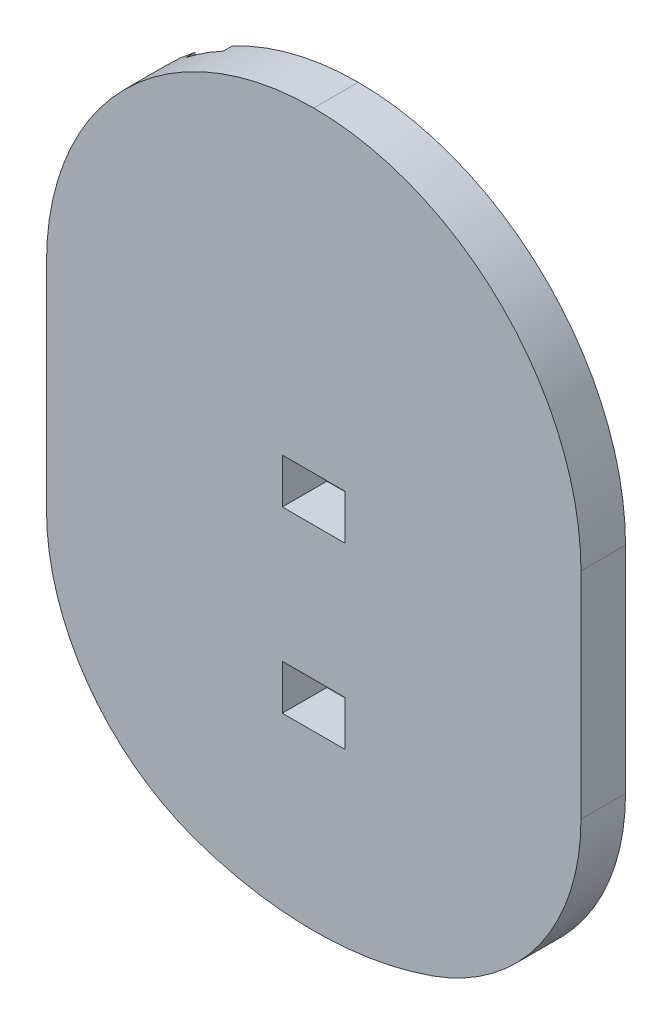
ISO-10303-21;
HEADER;
FILE_DESCRIPTION(('STEP AP214'),'2;1');
FILE_NAME('part.step','',(''),(''),'','','');
FILE_SCHEMA(('AUTOMOTIVE_DESIGN { 1 0 10303 214 1 1 1 1 }'));
ENDSEC;
DATA;
#1=APPLICATION_CONTEXT('core data for automotive mechanical design processes');
#2=APPLICATION_PROTOCOL_DEFINITION('international standard','automotive_design',2000,#1);
#3=PRODUCT_CONTEXT('',#1,'mechanical');
#4=PRODUCT('Part','Part','',(#3));
#5=PRODUCT_RELATED_PRODUCT_CATEGORY('part','',(#4));
#6=PRODUCT_DEFINITION_FORMATION('','',#4);
#7=PRODUCT_DEFINITION_CONTEXT('part definition',#1,'design');
#8=PRODUCT_DEFINITION('design','',#6,#7);
#9=PRODUCT_DEFINITION_SHAPE('','',#8);
#10=(LENGTH_UNIT() NAMED_UNIT(*) SI_UNIT(.MILLI.,.METRE.));
#11=(NAMED_UNIT(*) PLANE_ANGLE_UNIT() SI_UNIT($,.RADIAN.));
#12=(NAMED_UNIT(*) SI_UNIT($,.STERADIAN.) SOLID_ANGLE_UNIT());
#13=UNCERTAINTY_MEASURE_WITH_UNIT(LENGTH_MEASURE(1.E-05),#10,'distance_accuracy_value','');
#14=(GEOMETRIC_REPRESENTATION_CONTEXT(3) GLOBAL_UNCERTAINTY_ASSIGNED_CONTEXT((#13)) GLOBAL_UNIT_ASSIGNED_CONTEXT((#10,
#11,#12)) REPRESENTATION_CONTEXT('',''));
#15=CARTESIAN_POINT('',(0.,0.,0.));
#16=DIRECTION('',(0.,0.,1.));
#17=DIRECTION('',(1.,0.,0.));
#18=AXIS2_PLACEMENT_3D('',#15,#16,#17);
#19=CARTESIAN_POINT('',(0.,0.,5.));
#20=DIRECTION('',(0.,0.,-1.));
#21=DIRECTION('',(-1.,0.,0.));
#22=AXIS2_PLACEMENT_3D('',#19,#20,#21);
#23=CYLINDRICAL_SURFACE('',#22,40.);
#24=CARTESIAN_POINT('',(0.,0.,5.));
#25=DIRECTION('',(0.,0.,1.));
#26=DIRECTION('',(1.,0.,0.));
#27=AXIS2_PLACEMENT_3D('',#24,#25,#26);
#28=CIRCLE('',#27,40.);
#29=CARTESIAN_POINT('',(-13.3333333333333,-37.7123616632825,5.));
#30=VERTEX_POINT('',#29);
#31=CARTESIAN_POINT('',(13.3333333333333,-37.7123616632825,5.));
#32=VERTEX_POINT('',#31);
#33=EDGE_CURVE('E238',#30,#32,#28,.T.);
#34=ORIENTED_EDGE('',*,*,#33,.F.);
#35=DIRECTION('',(0.,0.,-1.));
#36=VECTOR('',#35,1.);
#37=CARTESIAN_POINT('',(-13.3333333333333,-37.7123616632825,5.));
#38=LINE('',#37,#36);
#39=CARTESIAN_POINT('',(-13.3333333333333,-37.7123616632825,0.));
#40=VERTEX_POINT('',#39);
#41=EDGE_CURVE('E276',#30,#40,#38,.T.);
#42=ORIENTED_EDGE('',*,*,#41,.T.);
#43=CARTESIAN_POINT('',(0.,0.,0.));
#44=DIRECTION('',(0.,0.,1.));
#45=DIRECTION('',(1.,0.,0.));
#46=AXIS2_PLACEMENT_3D('',#43,#44,#45);
#47=CIRCLE('',#46,40.);
#48=CARTESIAN_POINT('',(13.3333333333333,-37.7123616632825,0.));
#49=VERTEX_POINT('',#48);
#50=EDGE_CURVE('E234',#40,#49,#47,.T.);
#51=ORIENTED_EDGE('',*,*,#50,.T.);
#52=DIRECTION('',(0.,0.,-1.));
#53=VECTOR('',#52,1.);
#54=CARTESIAN_POINT('',(13.3333333333333,-37.7123616632825,5.));
#55=LINE('',#54,#53);
#56=EDGE_CURVE('E273',#49,#32,#55,.F.);
#57=ORIENTED_EDGE('',*,*,#56,.T.);
#58=EDGE_LOOP('',(#34,#42,#51,#57));
#59=FACE_BOUND('',#58,.T.);
#60=ADVANCED_FACE('F33',(#59),#23,.T.);
#61=CARTESIAN_POINT('',(0.,0.,5.));
#62=DIRECTION('',(0.,0.,1.));
#63=DIRECTION('',(1.,0.,0.));
#64=AXIS2_PLACEMENT_3D('',#61,#62,#63);
#65=PLANE('',#64);
#66=DIRECTION('',(0.,1.,0.));
#67=VECTOR('',#66,1.);
#68=CARTESIAN_POINT('',(3.525,4.5,5.));
#69=LINE('',#68,#67);
#70=CARTESIAN_POINT('',(3.525,-0.549999999999995,5.));
#71=VERTEX_POINT('',#70);
#72=CARTESIAN_POINT('',(3.525,4.5,5.));
#73=VERTEX_POINT('',#72);
#74=EDGE_CURVE('E56',#71,#73,#69,.T.);
#75=ORIENTED_EDGE('',*,*,#74,.F.);
#76=DIRECTION('',(1.,0.,0.));
#77=VECTOR('',#76,1.);
#78=CARTESIAN_POINT('',(-3.525,-0.549999999999995,5.));
#79=LINE('',#78,#77);
#80=CARTESIAN_POINT('',(-3.525,-0.549999999999995,5.));
#81=VERTEX_POINT('',#80);
#82=EDGE_CURVE('E202',#81,#71,#79,.T.);
#83=ORIENTED_EDGE('',*,*,#82,.F.);
#84=DIRECTION('',(0.,-1.,0.));
#85=VECTOR('',#84,1.);
#86=CARTESIAN_POINT('',(-3.525,4.5,5.));
#87=LINE('',#86,#85);
#88=CARTESIAN_POINT('',(-3.525,4.5,5.));
#89=VERTEX_POINT('',#88);
#90=EDGE_CURVE('E199',#89,#81,#87,.T.);
#91=ORIENTED_EDGE('',*,*,#90,.F.);
#92=DIRECTION('',(-1.,0.,0.));
#93=VECTOR('',#92,1.);
#94=CARTESIAN_POINT('',(-3.525,4.5,5.));
#95=LINE('',#94,#93);
#96=EDGE_CURVE('E195',#73,#89,#95,.T.);
#97=ORIENTED_EDGE('',*,*,#96,.F.);
#98=EDGE_LOOP('',(#75,#83,#91,#97));
#99=FACE_BOUND('',#98,.T.);
#100=DIRECTION('',(0.,1.,0.));
#101=VECTOR('',#100,1.);
#102=CARTESIAN_POINT('',(3.525,-15.55,5.));
#103=LINE('',#102,#101);
#104=CARTESIAN_POINT('',(3.525,-20.6,5.));
#105=VERTEX_POINT('',#104);
#106=CARTESIAN_POINT('',(3.525,-15.55,5.));
#107=VERTEX_POINT('',#106);
#108=EDGE_CURVE('E192',#105,#107,#103,.T.);
#109=ORIENTED_EDGE('',*,*,#108,.F.);
#110=DIRECTION('',(1.,0.,0.));
#111=VECTOR('',#110,1.);
#112=CARTESIAN_POINT('',(-3.525,-20.6,5.));
#113=LINE('',#112,#111);
#114=CARTESIAN_POINT('',(-3.525,-20.6,5.));
#115=VERTEX_POINT('',#114);
#116=EDGE_CURVE('E221',#115,#105,#113,.T.);
#117=ORIENTED_EDGE('',*,*,#116,.F.);
#118=DIRECTION('',(0.,-1.,0.));
#119=VECTOR('',#118,1.);
#120=CARTESIAN_POINT('',(-3.525,-15.55,5.));
#121=LINE('',#120,#119);
#122=CARTESIAN_POINT('',(-3.525,-15.55,5.));
#123=VERTEX_POINT('',#122);
#124=EDGE_CURVE('E218',#123,#115,#121,.T.);
#125=ORIENTED_EDGE('',*,*,#124,.F.);
#126=DIRECTION('',(-1.,0.,0.));
#127=VECTOR('',#126,1.);
#128=CARTESIAN_POINT('',(-3.525,-15.55,5.));
#129=LINE('',#128,#127);
#130=EDGE_CURVE('E215',#107,#123,#129,.T.);
#131=ORIENTED_EDGE('',*,*,#130,.F.);
#132=EDGE_LOOP('',(#109,#117,#125,#131));
#133=FACE_BOUND('',#132,.T.);
#134=DIRECTION('',(0.,1.,0.));
#135=VECTOR('',#134,1.);
#136=CARTESIAN_POINT('',(-30.,26.4575131106459,5.));
#137=LINE('',#136,#135);
#138=CARTESIAN_POINT('',(-30.,-14.1421356237309,5.));
#139=VERTEX_POINT('',#138);
#140=CARTESIAN_POINT('',(-30.,10.,5.));
#141=VERTEX_POINT('',#140);
#142=EDGE_CURVE('E232',#139,#141,#137,.T.);
#143=ORIENTED_EDGE('',*,*,#142,.F.);
#144=CARTESIAN_POINT('',(-5.,-14.142135623731,5.));
#145=DIRECTION('',(0.,0.,1.));
#146=DIRECTION('',(1.,0.,0.));
#147=AXIS2_PLACEMENT_3D('',#144,#145,#146);
#148=CIRCLE('',#147,25.);
#149=EDGE_CURVE('E271',#139,#30,#148,.T.);
#150=ORIENTED_EDGE('',*,*,#149,.T.);
#151=ORIENTED_EDGE('',*,*,#33,.T.);
#152=CARTESIAN_POINT('',(5.,-14.142135623731,5.));
#153=DIRECTION('',(0.,0.,1.));
#154=DIRECTION('',(1.,0.,0.));
#155=AXIS2_PLACEMENT_3D('',#152,#153,#154);
#156=CIRCLE('',#155,25.);
#157=CARTESIAN_POINT('',(30.,-14.1421356237309,5.));
#158=VERTEX_POINT('',#157);
#159=EDGE_CURVE('E269',#32,#158,#156,.T.);
#160=ORIENTED_EDGE('',*,*,#159,.T.);
#161=DIRECTION('',(0.,-1.,0.));
#162=VECTOR('',#161,1.);
#163=CARTESIAN_POINT('',(30.,26.4575131106459,5.));
#164=LINE('',#163,#162);
#165=CARTESIAN_POINT('',(30.,10.,5.));
#166=VERTEX_POINT('',#165);
#167=EDGE_CURVE('E235',#166,#158,#164,.T.);
#168=ORIENTED_EDGE('',*,*,#167,.F.);
#169=CARTESIAN_POINT('',(0.,10.,5.));
#170=DIRECTION('',(0.,0.,1.));
#171=DIRECTION('',(1.,0.,0.));
#172=AXIS2_PLACEMENT_3D('',#169,#170,#171);
#173=CIRCLE('',#172,30.);
#174=CARTESIAN_POINT('',(0.,40.,5.));
#175=VERTEX_POINT('',#174);
#176=EDGE_CURVE('E248',#166,#175,#173,.T.);
#177=ORIENTED_EDGE('',*,*,#176,.T.);
#178=CARTESIAN_POINT('',(0.,10.,5.));
#179=DIRECTION('',(0.,0.,1.));
#180=DIRECTION('',(1.,0.,0.));
#181=AXIS2_PLACEMENT_3D('',#178,#179,#180);
#182=CIRCLE('',#181,30.);
#183=EDGE_CURVE('E250',#175,#141,#182,.T.);
#184=ORIENTED_EDGE('',*,*,#183,.T.);
#185=EDGE_LOOP('',(#143,#150,#151,#160,#168,#177,#184));
#186=FACE_BOUND('',#185,.T.);
#187=ADVANCED_FACE('F327',(#99,#133,#186),#65,.T.);
#188=CARTESIAN_POINT('',(0.,0.,0.));
#189=DIRECTION('',(0.,0.,1.));
#190=DIRECTION('',(1.,0.,0.));
#191=AXIS2_PLACEMENT_3D('',#188,#189,#190);
#192=PLANE('',#191);
#193=DIRECTION('',(1.,0.,0.));
#194=VECTOR('',#193,1.);
#195=CARTESIAN_POINT('',(0.,-0.549999999999995,0.));
#196=LINE('',#195,#194);
#197=CARTESIAN_POINT('',(-3.525,-0.549999999999995,0.));
#198=VERTEX_POINT('',#197);
#199=CARTESIAN_POINT('',(3.525,-0.549999999999995,0.));
#200=VERTEX_POINT('',#199);
#201=EDGE_CURVE('E302',#198,#200,#196,.T.);
#202=ORIENTED_EDGE('',*,*,#201,.T.);
#203=DIRECTION('',(0.,1.,0.));
#204=VECTOR('',#203,1.);
#205=CARTESIAN_POINT('',(3.525,0.,0.));
#206=LINE('',#205,#204);
#207=CARTESIAN_POINT('',(3.525,4.5,0.));
#208=VERTEX_POINT('',#207);
#209=EDGE_CURVE('E305',#200,#208,#206,.T.);
#210=ORIENTED_EDGE('',*,*,#209,.T.);
#211=DIRECTION('',(-1.,0.,0.));
#212=VECTOR('',#211,1.);
#213=CARTESIAN_POINT('',(0.,4.5,0.));
#214=LINE('',#213,#212);
#215=CARTESIAN_POINT('',(-3.525,4.5,0.));
#216=VERTEX_POINT('',#215);
#217=EDGE_CURVE('E296',#208,#216,#214,.T.);
#218=ORIENTED_EDGE('',*,*,#217,.T.);
#219=DIRECTION('',(0.,-1.,0.));
#220=VECTOR('',#219,1.);
#221=CARTESIAN_POINT('',(-3.525,0.,0.));
#222=LINE('',#221,#220);
#223=EDGE_CURVE('E299',#216,#198,#222,.T.);
#224=ORIENTED_EDGE('',*,*,#223,.T.);
#225=EDGE_LOOP('',(#202,#210,#218,#224));
#226=FACE_BOUND('',#225,.T.);
#227=DIRECTION('',(1.,0.,0.));
#228=VECTOR('',#227,1.);
#229=CARTESIAN_POINT('',(0.,-20.6,0.));
#230=LINE('',#229,#228);
#231=CARTESIAN_POINT('',(-3.525,-20.6,0.));
#232=VERTEX_POINT('',#231);
#233=CARTESIAN_POINT('',(3.525,-20.6,0.));
#234=VERTEX_POINT('',#233);
#235=EDGE_CURVE('E290',#232,#234,#230,.T.);
#236=ORIENTED_EDGE('',*,*,#235,.T.);
#237=DIRECTION('',(0.,1.,0.));
#238=VECTOR('',#237,1.);
#239=CARTESIAN_POINT('',(3.525,0.,0.));
#240=LINE('',#239,#238);
#241=CARTESIAN_POINT('',(3.525,-15.55,0.));
#242=VERTEX_POINT('',#241);
#243=EDGE_CURVE('E293',#234,#242,#240,.T.);
#244=ORIENTED_EDGE('',*,*,#243,.T.);
#245=DIRECTION('',(-1.,0.,0.));
#246=VECTOR('',#245,1.);
#247=CARTESIAN_POINT('',(0.,-15.55,0.));
#248=LINE('',#247,#246);
#249=CARTESIAN_POINT('',(-3.525,-15.55,0.));
#250=VERTEX_POINT('',#249);
#251=EDGE_CURVE('E284',#242,#250,#248,.T.);
#252=ORIENTED_EDGE('',*,*,#251,.T.);
#253=DIRECTION('',(0.,-1.,0.));
#254=VECTOR('',#253,1.);
#255=CARTESIAN_POINT('',(-3.525,0.,0.));
#256=LINE('',#255,#254);
#257=EDGE_CURVE('E287',#250,#232,#256,.T.);
#258=ORIENTED_EDGE('',*,*,#257,.T.);
#259=EDGE_LOOP('',(#236,#244,#252,#258));
#260=FACE_BOUND('',#259,.T.);
#261=DIRECTION('',(-0.866025403784438,-0.500000000000001,0.));
#262=VECTOR('',#261,1.);
#263=CARTESIAN_POINT('',(-9.91829537858543,29.0997310684254,0.));
#264=LINE('',#263,#262);
#265=CARTESIAN_POINT('',(-9.91829537858543,29.0997310684254,0.));
#266=VERTEX_POINT('',#265);
#267=CARTESIAN_POINT('',(-14.2484223975076,26.5997310684254,0.));
#268=VERTEX_POINT('',#267);
#269=EDGE_CURVE('E189',#266,#268,#264,.T.);
#270=ORIENTED_EDGE('',*,*,#269,.F.);
#271=DIRECTION('',(0.500000000000001,-0.866025403784438,0.));
#272=VECTOR('',#271,1.);
#273=CARTESIAN_POINT('',(-14.1682953785854,36.4609470005931,0.));
#274=LINE('',#273,#272);
#275=CARTESIAN_POINT('',(-14.1606074909395,36.4476311885875,0.));
#276=VERTEX_POINT('',#275);
#277=EDGE_CURVE('E178',#276,#266,#274,.T.);
#278=ORIENTED_EDGE('',*,*,#277,.F.);
#279=CARTESIAN_POINT('',(0.,10.,0.));
#280=DIRECTION('',(0.,0.,1.));
#281=DIRECTION('',(1.,0.,0.));
#282=AXIS2_PLACEMENT_3D('',#279,#280,#281);
#283=CIRCLE('',#282,30.);
#284=CARTESIAN_POINT('',(0.,40.,0.));
#285=VERTEX_POINT('',#284);
#286=EDGE_CURVE('E258',#276,#285,#283,.F.);
#287=ORIENTED_EDGE('',*,*,#286,.T.);
#288=CARTESIAN_POINT('',(0.,10.,0.));
#289=DIRECTION('',(0.,0.,1.));
#290=DIRECTION('',(1.,0.,0.));
#291=AXIS2_PLACEMENT_3D('',#288,#289,#290);
#292=CIRCLE('',#291,30.);
#293=CARTESIAN_POINT('',(30.,10.,0.));
#294=VERTEX_POINT('',#293);
#295=EDGE_CURVE('E256',#285,#294,#292,.F.);
#296=ORIENTED_EDGE('',*,*,#295,.T.);
#297=DIRECTION('',(0.,-1.,0.));
#298=VECTOR('',#297,1.);
#299=CARTESIAN_POINT('',(30.,0.,0.));
#300=LINE('',#299,#298);
#301=CARTESIAN_POINT('',(30.,-14.142135623731,0.));
#302=VERTEX_POINT('',#301);
#303=EDGE_CURVE('E241',#294,#302,#300,.T.);
#304=ORIENTED_EDGE('',*,*,#303,.T.);
#305=CARTESIAN_POINT('',(5.,-14.142135623731,0.));
#306=DIRECTION('',(0.,0.,1.));
#307=DIRECTION('',(1.,0.,0.));
#308=AXIS2_PLACEMENT_3D('',#305,#306,#307);
#309=CIRCLE('',#308,25.);
#310=EDGE_CURVE('E278',#302,#49,#309,.F.);
#311=ORIENTED_EDGE('',*,*,#310,.T.);
#312=ORIENTED_EDGE('',*,*,#50,.F.);
#313=CARTESIAN_POINT('',(-5.,-14.142135623731,0.));
#314=DIRECTION('',(0.,0.,1.));
#315=DIRECTION('',(1.,0.,0.));
#316=AXIS2_PLACEMENT_3D('',#313,#314,#315);
#317=CIRCLE('',#316,25.);
#318=CARTESIAN_POINT('',(-30.,-14.142135623731,0.));
#319=VERTEX_POINT('',#318);
#320=EDGE_CURVE('E280',#40,#319,#317,.F.);
#321=ORIENTED_EDGE('',*,*,#320,.T.);
#322=DIRECTION('',(0.,1.,0.));
#323=VECTOR('',#322,1.);
#324=CARTESIAN_POINT('',(-30.,0.,0.));
#325=LINE('',#324,#323);
#326=CARTESIAN_POINT('',(-30.,10.,0.));
#327=VERTEX_POINT('',#326);
#328=EDGE_CURVE('E246',#319,#327,#325,.T.);
#329=ORIENTED_EDGE('',*,*,#328,.T.);
#330=CARTESIAN_POINT('',(-18.3618118800429,33.7243306434959,0.));
#331=VERTEX_POINT('',#330);
#332=EDGE_CURVE('E259',#327,#331,#283,.F.);
#333=ORIENTED_EDGE('',*,*,#332,.T.);
#334=DIRECTION('',(-0.500000000000001,0.866025403784438,0.));
#335=VECTOR('',#334,1.);
#336=CARTESIAN_POINT('',(-14.2484223975076,26.5997310684254,0.));
#337=LINE('',#336,#335);
#338=EDGE_CURVE('E172',#268,#331,#337,.T.);
#339=ORIENTED_EDGE('',*,*,#338,.F.);
#340=EDGE_LOOP('',(#270,#278,#287,#296,#304,#311,#312,#321,#329,#333,#339));
#341=FACE_BOUND('',#340,.T.);
#342=ADVANCED_FACE('F317',(#226,#260,#341),#192,.F.);
#343=CARTESIAN_POINT('',(30.,26.4575131106459,-5.));
#344=DIRECTION('',(-1.,0.,0.));
#345=DIRECTION('',(0.,0.,1.));
#346=AXIS2_PLACEMENT_3D('',#343,#344,#345);
#347=PLANE('',#346);
#348=ORIENTED_EDGE('',*,*,#167,.T.);
#349=DIRECTION('',(0.,0.,-1.));
#350=VECTOR('',#349,1.);
#351=CARTESIAN_POINT('',(30.,-14.1421356237309,-5.));
#352=LINE('',#351,#350);
#353=EDGE_CURVE('E282',#158,#302,#352,.T.);
#354=ORIENTED_EDGE('',*,*,#353,.T.);
#355=ORIENTED_EDGE('',*,*,#303,.F.);
#356=DIRECTION('',(0.,0.,-1.));
#357=VECTOR('',#356,1.);
#358=CARTESIAN_POINT('',(30.,10.,-5.));
#359=LINE('',#358,#357);
#360=EDGE_CURVE('E262',#294,#166,#359,.F.);
#361=ORIENTED_EDGE('',*,*,#360,.T.);
#362=EDGE_LOOP('',(#348,#354,#355,#361));
#363=FACE_BOUND('',#362,.T.);
#364=ADVANCED_FACE('F337',(#363),#347,.F.);
#365=CARTESIAN_POINT('',(-30.,26.4575131106459,-5.));
#366=DIRECTION('',(1.,0.,0.));
#367=DIRECTION('',(0.,0.,-1.));
#368=AXIS2_PLACEMENT_3D('',#365,#366,#367);
#369=PLANE('',#368);
#370=ORIENTED_EDGE('',*,*,#328,.F.);
#371=DIRECTION('',(0.,0.,-1.));
#372=VECTOR('',#371,1.);
#373=CARTESIAN_POINT('',(-30.,-14.1421356237309,-5.));
#374=LINE('',#373,#372);
#375=EDGE_CURVE('E264',#319,#139,#374,.F.);
#376=ORIENTED_EDGE('',*,*,#375,.T.);
#377=ORIENTED_EDGE('',*,*,#142,.T.);
#378=DIRECTION('',(0.,0.,-1.));
#379=VECTOR('',#378,1.);
#380=CARTESIAN_POINT('',(-30.,10.,-5.));
#381=LINE('',#380,#379);
#382=EDGE_CURVE('E253',#141,#327,#381,.T.);
#383=ORIENTED_EDGE('',*,*,#382,.T.);
#384=EDGE_LOOP('',(#370,#376,#377,#383));
#385=FACE_BOUND('',#384,.T.);
#386=ADVANCED_FACE('F323',(#385),#369,.F.);
#387=CARTESIAN_POINT('',(0.,10.,5.));
#388=DIRECTION('',(0.,0.,-1.));
#389=DIRECTION('',(-1.,0.,0.));
#390=AXIS2_PLACEMENT_3D('',#387,#388,#389);
#391=CYLINDRICAL_SURFACE('',#390,30.);
#392=ORIENTED_EDGE('',*,*,#360,.F.);
#393=ORIENTED_EDGE('',*,*,#295,.F.);
#394=DIRECTION('',(0.,0.,-1.));
#395=VECTOR('',#394,1.);
#396=CARTESIAN_POINT('',(0.,40.,5.));
#397=LINE('',#396,#395);
#398=EDGE_CURVE('E208',#175,#285,#397,.T.);
#399=ORIENTED_EDGE('',*,*,#398,.F.);
#400=ORIENTED_EDGE('',*,*,#176,.F.);
#401=EDGE_LOOP('',(#392,#393,#399,#400));
#402=FACE_BOUND('',#401,.T.);
#403=ADVANCED_FACE('F333',(#402),#391,.T.);
#404=CARTESIAN_POINT('',(0.,10.,5.));
#405=DIRECTION('',(0.,0.,-1.));
#406=DIRECTION('',(-1.,0.,0.));
#407=AXIS2_PLACEMENT_3D('',#404,#405,#406);
#408=CYLINDRICAL_SURFACE('',#407,30.);
#409=DIRECTION('',(0.,0.,-1.));
#410=VECTOR('',#409,1.);
#411=CARTESIAN_POINT('',(-14.1606074909395,36.4476311885875,5.));
#412=LINE('',#411,#410);
#413=CARTESIAN_POINT('',(-14.1606074909395,36.4476311885875,1.));
#414=VERTEX_POINT('',#413);
#415=EDGE_CURVE('E11',#414,#276,#412,.T.);
#416=ORIENTED_EDGE('',*,*,#415,.F.);
#417=CARTESIAN_POINT('',(0.,10.,1.));
#418=DIRECTION('',(0.,0.,-1.));
#419=DIRECTION('',(-1.,0.,0.));
#420=AXIS2_PLACEMENT_3D('',#417,#418,#419);
#421=CIRCLE('',#420,30.);
#422=CARTESIAN_POINT('',(-18.3618118800429,33.7243306434959,1.));
#423=VERTEX_POINT('',#422);
#424=EDGE_CURVE('E169',#414,#423,#421,.F.);
#425=ORIENTED_EDGE('',*,*,#424,.T.);
#426=DIRECTION('',(0.,0.,-1.));
#427=VECTOR('',#426,1.);
#428=CARTESIAN_POINT('',(-18.3618118800429,33.7243306434959,5.));
#429=LINE('',#428,#427);
#430=EDGE_CURVE('E41',#331,#423,#429,.F.);
#431=ORIENTED_EDGE('',*,*,#430,.F.);
#432=ORIENTED_EDGE('',*,*,#332,.F.);
#433=ORIENTED_EDGE('',*,*,#382,.F.);
#434=ORIENTED_EDGE('',*,*,#183,.F.);
#435=ORIENTED_EDGE('',*,*,#398,.T.);
#436=ORIENTED_EDGE('',*,*,#286,.F.);
#437=EDGE_LOOP('',(#416,#425,#431,#432,#433,#434,#435,#436));
#438=FACE_BOUND('',#437,.T.);
#439=ADVANCED_FACE('F314',(#438),#408,.T.);
#440=CARTESIAN_POINT('',(-5.,-14.142135623731,5.));
#441=DIRECTION('',(0.,0.,-1.));
#442=DIRECTION('',(-1.,0.,0.));
#443=AXIS2_PLACEMENT_3D('',#440,#441,#442);
#444=CYLINDRICAL_SURFACE('',#443,25.);
#445=ORIENTED_EDGE('',*,*,#320,.F.);
#446=ORIENTED_EDGE('',*,*,#41,.F.);
#447=ORIENTED_EDGE('',*,*,#149,.F.);
#448=ORIENTED_EDGE('',*,*,#375,.F.);
#449=EDGE_LOOP('',(#445,#446,#447,#448));
#450=FACE_BOUND('',#449,.T.);
#451=ADVANCED_FACE('F347',(#450),#444,.T.);
#452=CARTESIAN_POINT('',(5.,-14.142135623731,5.));
#453=DIRECTION('',(0.,0.,-1.));
#454=DIRECTION('',(-1.,0.,0.));
#455=AXIS2_PLACEMENT_3D('',#452,#453,#454);
#456=CYLINDRICAL_SURFACE('',#455,25.);
#457=ORIENTED_EDGE('',*,*,#310,.F.);
#458=ORIENTED_EDGE('',*,*,#353,.F.);
#459=ORIENTED_EDGE('',*,*,#159,.F.);
#460=ORIENTED_EDGE('',*,*,#56,.F.);
#461=EDGE_LOOP('',(#457,#458,#459,#460));
#462=FACE_BOUND('',#461,.T.);
#463=ADVANCED_FACE('F35',(#462),#456,.T.);
#464=CARTESIAN_POINT('',(3.525,-15.55,-5.));
#465=DIRECTION('',(1.,0.,0.));
#466=DIRECTION('',(0.,1.,0.));
#467=AXIS2_PLACEMENT_3D('',#464,#465,#466);
#468=PLANE('',#467);
#469=DIRECTION('',(0.,0.,1.));
#470=VECTOR('',#469,1.);
#471=CARTESIAN_POINT('',(3.525,-20.6,-5.));
#472=LINE('',#471,#470);
#473=EDGE_CURVE('E196',#234,#105,#472,.T.);
#474=ORIENTED_EDGE('',*,*,#473,.T.);
#475=ORIENTED_EDGE('',*,*,#108,.T.);
#476=DIRECTION('',(0.,0.,1.));
#477=VECTOR('',#476,1.);
#478=CARTESIAN_POINT('',(3.525,-15.55,-5.));
#479=LINE('',#478,#477);
#480=EDGE_CURVE('E224',#242,#107,#479,.T.);
#481=ORIENTED_EDGE('',*,*,#480,.F.);
#482=ORIENTED_EDGE('',*,*,#243,.F.);
#483=EDGE_LOOP('',(#474,#475,#481,#482));
#484=FACE_BOUND('',#483,.T.);
#485=ADVANCED_FACE('F353',(#484),#468,.F.);
#486=CARTESIAN_POINT('',(-3.525,-20.6,-5.));
#487=DIRECTION('',(0.,-1.,0.));
#488=DIRECTION('',(0.,0.,-1.));
#489=AXIS2_PLACEMENT_3D('',#486,#487,#488);
#490=PLANE('',#489);
#491=DIRECTION('',(0.,0.,1.));
#492=VECTOR('',#491,1.);
#493=CARTESIAN_POINT('',(-3.525,-20.6,-5.));
#494=LINE('',#493,#492);
#495=EDGE_CURVE('E226',#232,#115,#494,.T.);
#496=ORIENTED_EDGE('',*,*,#495,.T.);
#497=ORIENTED_EDGE('',*,*,#116,.T.);
#498=ORIENTED_EDGE('',*,*,#473,.F.);
#499=ORIENTED_EDGE('',*,*,#235,.F.);
#500=EDGE_LOOP('',(#496,#497,#498,#499));
#501=FACE_BOUND('',#500,.T.);
#502=ADVANCED_FACE('F377',(#501),#490,.F.);
#503=CARTESIAN_POINT('',(-3.525,-15.55,-5.));
#504=DIRECTION('',(-1.,0.,0.));
#505=DIRECTION('',(0.,-1.,0.));
#506=AXIS2_PLACEMENT_3D('',#503,#504,#505);
#507=PLANE('',#506);
#508=DIRECTION('',(0.,0.,1.));
#509=VECTOR('',#508,1.);
#510=CARTESIAN_POINT('',(-3.525,-15.55,-5.));
#511=LINE('',#510,#509);
#512=EDGE_CURVE('E228',#250,#123,#511,.T.);
#513=ORIENTED_EDGE('',*,*,#512,.T.);
#514=ORIENTED_EDGE('',*,*,#124,.T.);
#515=ORIENTED_EDGE('',*,*,#495,.F.);
#516=ORIENTED_EDGE('',*,*,#257,.F.);
#517=EDGE_LOOP('',(#513,#514,#515,#516));
#518=FACE_BOUND('',#517,.T.);
#519=ADVANCED_FACE('F383',(#518),#507,.F.);
#520=CARTESIAN_POINT('',(-3.525,-15.55,-5.));
#521=DIRECTION('',(0.,1.,0.));
#522=DIRECTION('',(0.,0.,1.));
#523=AXIS2_PLACEMENT_3D('',#520,#521,#522);
#524=PLANE('',#523);
#525=ORIENTED_EDGE('',*,*,#480,.T.);
#526=ORIENTED_EDGE('',*,*,#130,.T.);
#527=ORIENTED_EDGE('',*,*,#512,.F.);
#528=ORIENTED_EDGE('',*,*,#251,.F.);
#529=EDGE_LOOP('',(#525,#526,#527,#528));
#530=FACE_BOUND('',#529,.T.);
#531=ADVANCED_FACE('F379',(#530),#524,.F.);
#532=CARTESIAN_POINT('',(3.525,4.5,-5.));
#533=DIRECTION('',(1.,0.,0.));
#534=DIRECTION('',(0.,1.,0.));
#535=AXIS2_PLACEMENT_3D('',#532,#533,#534);
#536=PLANE('',#535);
#537=DIRECTION('',(0.,0.,1.));
#538=VECTOR('',#537,1.);
#539=CARTESIAN_POINT('',(3.525,-0.549999999999995,-5.));
#540=LINE('',#539,#538);
#541=EDGE_CURVE('E206',#200,#71,#540,.T.);
#542=ORIENTED_EDGE('',*,*,#541,.T.);
#543=ORIENTED_EDGE('',*,*,#74,.T.);
#544=DIRECTION('',(0.,0.,1.));
#545=VECTOR('',#544,1.);
#546=CARTESIAN_POINT('',(3.525,4.5,-5.));
#547=LINE('',#546,#545);
#548=EDGE_CURVE('E205',#208,#73,#547,.T.);
#549=ORIENTED_EDGE('',*,*,#548,.F.);
#550=ORIENTED_EDGE('',*,*,#209,.F.);
#551=EDGE_LOOP('',(#542,#543,#549,#550));
#552=FACE_BOUND('',#551,.T.);
#553=ADVANCED_FACE('F382',(#552),#536,.F.);
#554=CARTESIAN_POINT('',(-3.525,-0.549999999999995,-5.));
#555=DIRECTION('',(0.,-1.,0.));
#556=DIRECTION('',(1.,0.,0.));
#557=AXIS2_PLACEMENT_3D('',#554,#555,#556);
#558=PLANE('',#557);
#559=DIRECTION('',(0.,0.,1.));
#560=VECTOR('',#559,1.);
#561=CARTESIAN_POINT('',(-3.525,-0.549999999999995,-5.));
#562=LINE('',#561,#560);
#563=EDGE_CURVE('E209',#198,#81,#562,.T.);
#564=ORIENTED_EDGE('',*,*,#563,.T.);
#565=ORIENTED_EDGE('',*,*,#82,.T.);
#566=ORIENTED_EDGE('',*,*,#541,.F.);
#567=ORIENTED_EDGE('',*,*,#201,.F.);
#568=EDGE_LOOP('',(#564,#565,#566,#567));
#569=FACE_BOUND('',#568,.T.);
#570=ADVANCED_FACE('F393',(#569),#558,.F.);
#571=CARTESIAN_POINT('',(-3.525,4.5,-5.));
#572=DIRECTION('',(-1.,0.,0.));
#573=DIRECTION('',(0.,-1.,0.));
#574=AXIS2_PLACEMENT_3D('',#571,#572,#573);
#575=PLANE('',#574);
#576=DIRECTION('',(0.,0.,1.));
#577=VECTOR('',#576,1.);
#578=CARTESIAN_POINT('',(-3.525,4.5,-5.));
#579=LINE('',#578,#577);
#580=EDGE_CURVE('E211',#216,#89,#579,.T.);
#581=ORIENTED_EDGE('',*,*,#580,.T.);
#582=ORIENTED_EDGE('',*,*,#90,.T.);
#583=ORIENTED_EDGE('',*,*,#563,.F.);
#584=ORIENTED_EDGE('',*,*,#223,.F.);
#585=EDGE_LOOP('',(#581,#582,#583,#584));
#586=FACE_BOUND('',#585,.T.);
#587=ADVANCED_FACE('F397',(#586),#575,.F.);
#588=CARTESIAN_POINT('',(-3.525,4.5,-5.));
#589=DIRECTION('',(0.,1.,0.));
#590=DIRECTION('',(0.,0.,1.));
#591=AXIS2_PLACEMENT_3D('',#588,#589,#590);
#592=PLANE('',#591);
#593=ORIENTED_EDGE('',*,*,#548,.T.);
#594=ORIENTED_EDGE('',*,*,#96,.T.);
#595=ORIENTED_EDGE('',*,*,#580,.F.);
#596=ORIENTED_EDGE('',*,*,#217,.F.);
#597=EDGE_LOOP('',(#593,#594,#595,#596));
#598=FACE_BOUND('',#597,.T.);
#599=ADVANCED_FACE('F394',(#598),#592,.F.);
#600=CARTESIAN_POINT('',(-14.1682953785854,36.4609470005931,1.));
#601=DIRECTION('',(0.866025403784438,0.500000000000001,0.));
#602=DIRECTION('',(-0.500000000000001,0.866025403784438,0.));
#603=AXIS2_PLACEMENT_3D('',#600,#601,#602);
#604=PLANE('',#603);
#605=ORIENTED_EDGE('',*,*,#415,.T.);
#606=ORIENTED_EDGE('',*,*,#277,.T.);
#607=DIRECTION('',(0.,0.,-1.));
#608=VECTOR('',#607,1.);
#609=CARTESIAN_POINT('',(-9.91829537858543,29.0997310684254,1.));
#610=LINE('',#609,#608);
#611=CARTESIAN_POINT('',(-9.91829537858543,29.0997310684254,1.));
#612=VERTEX_POINT('',#611);
#613=EDGE_CURVE('E175',#612,#266,#610,.T.);
#614=ORIENTED_EDGE('',*,*,#613,.F.);
#615=DIRECTION('',(0.500000000000001,-0.866025403784438,0.));
#616=VECTOR('',#615,1.);
#617=CARTESIAN_POINT('',(-14.1682953785854,36.4609470005931,1.));
#618=LINE('',#617,#616);
#619=EDGE_CURVE('E163',#414,#612,#618,.T.);
#620=ORIENTED_EDGE('',*,*,#619,.F.);
#621=EDGE_LOOP('',(#605,#606,#614,#620));
#622=FACE_BOUND('',#621,.T.);
#623=ADVANCED_FACE('F176',(#622),#604,.F.);
#624=CARTESIAN_POINT('',(-14.2484223975076,26.5997310684254,1.));
#625=DIRECTION('',(-0.866025403784438,-0.500000000000001,0.));
#626=DIRECTION('',(0.500000000000001,-0.866025403784438,0.));
#627=AXIS2_PLACEMENT_3D('',#624,#625,#626);
#628=PLANE('',#627);
#629=ORIENTED_EDGE('',*,*,#430,.T.);
#630=DIRECTION('',(-0.500000000000001,0.866025403784438,0.));
#631=VECTOR('',#630,1.);
#632=CARTESIAN_POINT('',(-14.2484223975076,26.5997310684254,1.));
#633=LINE('',#632,#631);
#634=CARTESIAN_POINT('',(-14.2484223975076,26.5997310684254,1.));
#635=VERTEX_POINT('',#634);
#636=EDGE_CURVE('E48',#635,#423,#633,.T.);
#637=ORIENTED_EDGE('',*,*,#636,.F.);
#638=DIRECTION('',(0.,0.,-1.));
#639=VECTOR('',#638,1.);
#640=CARTESIAN_POINT('',(-14.2484223975076,26.5997310684254,1.));
#641=LINE('',#640,#639);
#642=EDGE_CURVE('E182',#635,#268,#641,.T.);
#643=ORIENTED_EDGE('',*,*,#642,.T.);
#644=ORIENTED_EDGE('',*,*,#338,.T.);
#645=EDGE_LOOP('',(#629,#637,#643,#644));
#646=FACE_BOUND('',#645,.T.);
#647=ADVANCED_FACE('F310',(#646),#628,.F.);
#648=CARTESIAN_POINT('',(-9.91829537858543,29.0997310684254,1.));
#649=DIRECTION('',(0.500000000000001,-0.866025403784438,0.));
#650=DIRECTION('',(0.866025403784438,0.500000000000001,0.));
#651=AXIS2_PLACEMENT_3D('',#648,#649,#650);
#652=PLANE('',#651);
#653=ORIENTED_EDGE('',*,*,#269,.T.);
#654=ORIENTED_EDGE('',*,*,#642,.F.);
#655=DIRECTION('',(-0.866025403784438,-0.500000000000001,0.));
#656=VECTOR('',#655,1.);
#657=CARTESIAN_POINT('',(-9.91829537858543,29.0997310684254,1.));
#658=LINE('',#657,#656);
#659=EDGE_CURVE('E167',#612,#635,#658,.T.);
#660=ORIENTED_EDGE('',*,*,#659,.F.);
#661=ORIENTED_EDGE('',*,*,#613,.T.);
#662=EDGE_LOOP('',(#653,#654,#660,#661));
#663=FACE_BOUND('',#662,.T.);
#664=ADVANCED_FACE('F184',(#663),#652,.F.);
#665=CARTESIAN_POINT('',(0.,0.,1.));
#666=DIRECTION('',(0.,0.,-1.));
#667=DIRECTION('',(-1.,0.,0.));
#668=AXIS2_PLACEMENT_3D('',#665,#666,#667);
#669=PLANE('',#668);
#670=ORIENTED_EDGE('',*,*,#619,.T.);
#671=ORIENTED_EDGE('',*,*,#659,.T.);
#672=ORIENTED_EDGE('',*,*,#636,.T.);
#673=ORIENTED_EDGE('',*,*,#424,.F.);
#674=EDGE_LOOP('',(#670,#671,#672,#673));
#675=FACE_BOUND('',#674,.T.);
#676=ADVANCED_FACE('F165',(#675),#669,.T.);
#677=CLOSED_SHELL('',(#60,#187,#342,#364,#386,#403,#439,#451,#463,#485,#502,#519,#531,#553,#570,
#587,#599,#623,#647,#664,#676));
#678=MANIFOLD_SOLID_BREP('B2',#677);
#679=ADVANCED_BREP_SHAPE_REPRESENTATION('',(#18,#678),#14);
#680=SHAPE_DEFINITION_REPRESENTATION(#9,#679);
ENDSEC;
END-ISO-10303-21;
